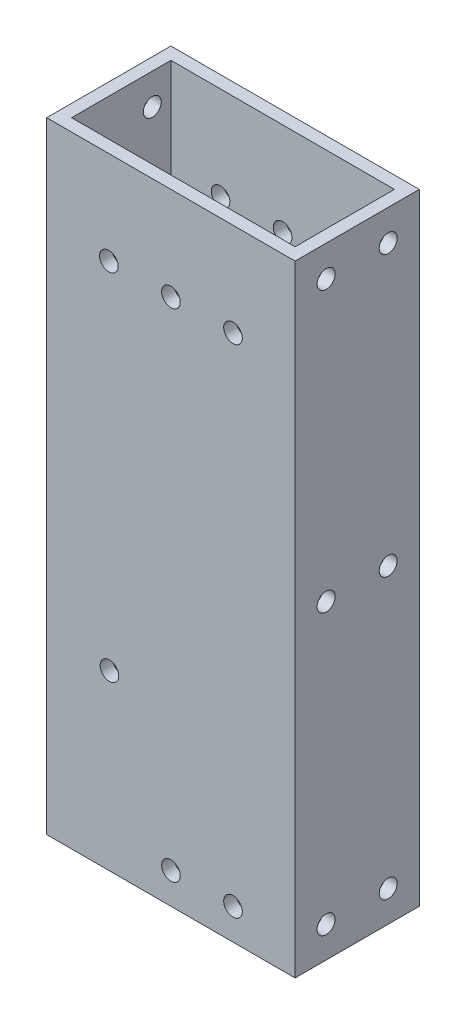
ISO-10303-21;
HEADER;
FILE_DESCRIPTION(('STEP AP214'),'2;1');
FILE_NAME('part.step','',(''),(''),'','','');
FILE_SCHEMA(('AUTOMOTIVE_DESIGN { 1 0 10303 214 1 1 1 1 }'));
ENDSEC;
DATA;
#1=APPLICATION_CONTEXT('core data for automotive mechanical design processes');
#2=APPLICATION_PROTOCOL_DEFINITION('international standard','automotive_design',2000,#1);
#3=PRODUCT_CONTEXT('',#1,'mechanical');
#4=PRODUCT('Part','Part','',(#3));
#5=PRODUCT_RELATED_PRODUCT_CATEGORY('part','',(#4));
#6=PRODUCT_DEFINITION_FORMATION('','',#4);
#7=PRODUCT_DEFINITION_CONTEXT('part definition',#1,'design');
#8=PRODUCT_DEFINITION('design','',#6,#7);
#9=PRODUCT_DEFINITION_SHAPE('','',#8);
#10=(LENGTH_UNIT() NAMED_UNIT(*) SI_UNIT(.MILLI.,.METRE.));
#11=(NAMED_UNIT(*) PLANE_ANGLE_UNIT() SI_UNIT($,.RADIAN.));
#12=(NAMED_UNIT(*) SI_UNIT($,.STERADIAN.) SOLID_ANGLE_UNIT());
#13=UNCERTAINTY_MEASURE_WITH_UNIT(LENGTH_MEASURE(1.E-05),#10,'distance_accuracy_value','');
#14=(GEOMETRIC_REPRESENTATION_CONTEXT(3) GLOBAL_UNCERTAINTY_ASSIGNED_CONTEXT((#13)) GLOBAL_UNIT_ASSIGNED_CONTEXT((#10,
#11,#12)) REPRESENTATION_CONTEXT('',''));
#15=CARTESIAN_POINT('',(0.,0.,0.));
#16=DIRECTION('',(0.,0.,1.));
#17=DIRECTION('',(1.,0.,0.));
#18=AXIS2_PLACEMENT_3D('',#15,#16,#17);
#19=CARTESIAN_POINT('',(0.,50.,0.));
#20=DIRECTION('',(0.,1.,0.));
#21=DIRECTION('',(0.,0.,1.));
#22=AXIS2_PLACEMENT_3D('',#19,#20,#21);
#23=PLANE('',#22);
#24=DIRECTION('',(0.,0.,-1.));
#25=VECTOR('',#24,1.);
#26=CARTESIAN_POINT('',(20.,50.,-10.));
#27=LINE('',#26,#25);
#28=CARTESIAN_POINT('',(20.,50.,10.));
#29=VERTEX_POINT('',#28);
#30=CARTESIAN_POINT('',(20.,50.,-10.));
#31=VERTEX_POINT('',#30);
#32=EDGE_CURVE('E143',#29,#31,#27,.T.);
#33=ORIENTED_EDGE('',*,*,#32,.T.);
#34=DIRECTION('',(-1.,0.,0.));
#35=VECTOR('',#34,1.);
#36=CARTESIAN_POINT('',(-20.,50.,-10.));
#37=LINE('',#36,#35);
#38=CARTESIAN_POINT('',(-20.,50.,-10.));
#39=VERTEX_POINT('',#38);
#40=EDGE_CURVE('E146',#31,#39,#37,.T.);
#41=ORIENTED_EDGE('',*,*,#40,.T.);
#42=DIRECTION('',(0.,0.,1.));
#43=VECTOR('',#42,1.);
#44=CARTESIAN_POINT('',(-20.,50.,-10.));
#45=LINE('',#44,#43);
#46=CARTESIAN_POINT('',(-20.,50.,10.));
#47=VERTEX_POINT('',#46);
#48=EDGE_CURVE('E149',#39,#47,#45,.T.);
#49=ORIENTED_EDGE('',*,*,#48,.T.);
#50=DIRECTION('',(1.,0.,0.));
#51=VECTOR('',#50,1.);
#52=CARTESIAN_POINT('',(-20.,50.,10.));
#53=LINE('',#52,#51);
#54=EDGE_CURVE('E151',#47,#29,#53,.T.);
#55=ORIENTED_EDGE('',*,*,#54,.T.);
#56=EDGE_LOOP('',(#33,#41,#49,#55));
#57=FACE_BOUND('',#56,.T.);
#58=DIRECTION('',(-1.,0.,0.));
#59=VECTOR('',#58,1.);
#60=CARTESIAN_POINT('',(-18.,50.,-8.));
#61=LINE('',#60,#59);
#62=CARTESIAN_POINT('',(18.,50.,-8.));
#63=VERTEX_POINT('',#62);
#64=CARTESIAN_POINT('',(-18.,50.,-8.));
#65=VERTEX_POINT('',#64);
#66=EDGE_CURVE('E113',#63,#65,#61,.T.);
#67=ORIENTED_EDGE('',*,*,#66,.F.);
#68=DIRECTION('',(0.,0.,-1.));
#69=VECTOR('',#68,1.);
#70=CARTESIAN_POINT('',(18.,50.,-8.));
#71=LINE('',#70,#69);
#72=CARTESIAN_POINT('',(18.,50.,8.));
#73=VERTEX_POINT('',#72);
#74=EDGE_CURVE('E105',#73,#63,#71,.T.);
#75=ORIENTED_EDGE('',*,*,#74,.F.);
#76=DIRECTION('',(1.,0.,0.));
#77=VECTOR('',#76,1.);
#78=CARTESIAN_POINT('',(-18.,50.,8.));
#79=LINE('',#78,#77);
#80=CARTESIAN_POINT('',(-18.,50.,8.));
#81=VERTEX_POINT('',#80);
#82=EDGE_CURVE('E127',#81,#73,#79,.T.);
#83=ORIENTED_EDGE('',*,*,#82,.F.);
#84=DIRECTION('',(0.,0.,1.));
#85=VECTOR('',#84,1.);
#86=CARTESIAN_POINT('',(-18.,50.,-8.));
#87=LINE('',#86,#85);
#88=EDGE_CURVE('E125',#65,#81,#87,.T.);
#89=ORIENTED_EDGE('',*,*,#88,.F.);
#90=EDGE_LOOP('',(#67,#75,#83,#89));
#91=FACE_BOUND('',#90,.T.);
#92=ADVANCED_FACE('F38',(#57,#91),#23,.T.);
#93=CARTESIAN_POINT('',(0.,-50.,0.));
#94=DIRECTION('',(0.,1.,0.));
#95=DIRECTION('',(0.,0.,1.));
#96=AXIS2_PLACEMENT_3D('',#93,#94,#95);
#97=PLANE('',#96);
#98=DIRECTION('',(0.,0.,-1.));
#99=VECTOR('',#98,1.);
#100=CARTESIAN_POINT('',(20.,-50.,-10.));
#101=LINE('',#100,#99);
#102=CARTESIAN_POINT('',(20.,-50.,10.));
#103=VERTEX_POINT('',#102);
#104=CARTESIAN_POINT('',(20.,-50.,-10.));
#105=VERTEX_POINT('',#104);
#106=EDGE_CURVE('E121',#103,#105,#101,.T.);
#107=ORIENTED_EDGE('',*,*,#106,.F.);
#108=DIRECTION('',(1.,0.,0.));
#109=VECTOR('',#108,1.);
#110=CARTESIAN_POINT('',(-20.,-50.,10.));
#111=LINE('',#110,#109);
#112=CARTESIAN_POINT('',(-20.,-50.,10.));
#113=VERTEX_POINT('',#112);
#114=EDGE_CURVE('E147',#113,#103,#111,.T.);
#115=ORIENTED_EDGE('',*,*,#114,.F.);
#116=DIRECTION('',(0.,0.,1.));
#117=VECTOR('',#116,1.);
#118=CARTESIAN_POINT('',(-20.,-50.,-10.));
#119=LINE('',#118,#117);
#120=CARTESIAN_POINT('',(-20.,-50.,-10.));
#121=VERTEX_POINT('',#120);
#122=EDGE_CURVE('E158',#121,#113,#119,.T.);
#123=ORIENTED_EDGE('',*,*,#122,.F.);
#124=DIRECTION('',(-1.,0.,0.));
#125=VECTOR('',#124,1.);
#126=CARTESIAN_POINT('',(-20.,-50.,-10.));
#127=LINE('',#126,#125);
#128=EDGE_CURVE('E156',#105,#121,#127,.T.);
#129=ORIENTED_EDGE('',*,*,#128,.F.);
#130=EDGE_LOOP('',(#107,#115,#123,#129));
#131=FACE_BOUND('',#130,.T.);
#132=DIRECTION('',(0.,0.,-1.));
#133=VECTOR('',#132,1.);
#134=CARTESIAN_POINT('',(18.,-50.,-8.));
#135=LINE('',#134,#133);
#136=CARTESIAN_POINT('',(18.,-50.,8.));
#137=VERTEX_POINT('',#136);
#138=CARTESIAN_POINT('',(18.,-50.,-8.));
#139=VERTEX_POINT('',#138);
#140=EDGE_CURVE('E63',#137,#139,#135,.T.);
#141=ORIENTED_EDGE('',*,*,#140,.T.);
#142=DIRECTION('',(-1.,0.,0.));
#143=VECTOR('',#142,1.);
#144=CARTESIAN_POINT('',(-18.,-50.,-8.));
#145=LINE('',#144,#143);
#146=CARTESIAN_POINT('',(-18.,-50.,-8.));
#147=VERTEX_POINT('',#146);
#148=EDGE_CURVE('E120',#139,#147,#145,.T.);
#149=ORIENTED_EDGE('',*,*,#148,.T.);
#150=DIRECTION('',(0.,0.,1.));
#151=VECTOR('',#150,1.);
#152=CARTESIAN_POINT('',(-18.,-50.,-8.));
#153=LINE('',#152,#151);
#154=CARTESIAN_POINT('',(-18.,-50.,8.));
#155=VERTEX_POINT('',#154);
#156=EDGE_CURVE('E135',#147,#155,#153,.T.);
#157=ORIENTED_EDGE('',*,*,#156,.T.);
#158=DIRECTION('',(1.,0.,0.));
#159=VECTOR('',#158,1.);
#160=CARTESIAN_POINT('',(-18.,-50.,8.));
#161=LINE('',#160,#159);
#162=EDGE_CURVE('E114',#155,#137,#161,.T.);
#163=ORIENTED_EDGE('',*,*,#162,.T.);
#164=EDGE_LOOP('',(#141,#149,#157,#163));
#165=FACE_BOUND('',#164,.T.);
#166=ADVANCED_FACE('F326',(#131,#165),#97,.F.);
#167=CARTESIAN_POINT('',(20.,50.,-10.));
#168=DIRECTION('',(-1.,0.,0.));
#169=DIRECTION('',(0.,0.,1.));
#170=AXIS2_PLACEMENT_3D('',#167,#168,#169);
#171=PLANE('',#170);
#172=CARTESIAN_POINT('',(20.,-45.,-5.00000000000001));
#173=DIRECTION('',(1.,0.,0.));
#174=DIRECTION('',(0.,0.,-1.));
#175=AXIS2_PLACEMENT_3D('',#172,#173,#174);
#176=CIRCLE('',#175,1.45);
#177=CARTESIAN_POINT('',(20.,-45.,-6.45000000000001));
#178=VERTEX_POINT('',#177);
#179=EDGE_CURVE('E254',#178,#178,#176,.T.);
#180=ORIENTED_EDGE('',*,*,#179,.F.);
#181=EDGE_LOOP('',(#180));
#182=FACE_BOUND('',#181,.T.);
#183=CARTESIAN_POINT('',(20.,0.,4.99999999999999));
#184=DIRECTION('',(1.,0.,0.));
#185=DIRECTION('',(0.,0.,-1.));
#186=AXIS2_PLACEMENT_3D('',#183,#184,#185);
#187=CIRCLE('',#186,1.45);
#188=CARTESIAN_POINT('',(20.,0.,3.54999999999999));
#189=VERTEX_POINT('',#188);
#190=EDGE_CURVE('E261',#189,#189,#187,.T.);
#191=ORIENTED_EDGE('',*,*,#190,.F.);
#192=EDGE_LOOP('',(#191));
#193=FACE_BOUND('',#192,.T.);
#194=CARTESIAN_POINT('',(20.,0.,-5.00000000000001));
#195=DIRECTION('',(1.,0.,0.));
#196=DIRECTION('',(0.,0.,-1.));
#197=AXIS2_PLACEMENT_3D('',#194,#195,#196);
#198=CIRCLE('',#197,1.45);
#199=CARTESIAN_POINT('',(20.,0.,-6.45000000000001));
#200=VERTEX_POINT('',#199);
#201=EDGE_CURVE('E260',#200,#200,#198,.T.);
#202=ORIENTED_EDGE('',*,*,#201,.F.);
#203=EDGE_LOOP('',(#202));
#204=FACE_BOUND('',#203,.T.);
#205=CARTESIAN_POINT('',(20.,45.,-5.));
#206=DIRECTION('',(1.,0.,0.));
#207=DIRECTION('',(0.,0.,-1.));
#208=AXIS2_PLACEMENT_3D('',#205,#206,#207);
#209=CIRCLE('',#208,1.45);
#210=CARTESIAN_POINT('',(20.,45.,-6.45));
#211=VERTEX_POINT('',#210);
#212=EDGE_CURVE('E273',#211,#211,#209,.T.);
#213=ORIENTED_EDGE('',*,*,#212,.F.);
#214=EDGE_LOOP('',(#213));
#215=FACE_BOUND('',#214,.T.);
#216=CARTESIAN_POINT('',(20.,-45.,4.99999999999999));
#217=DIRECTION('',(1.,0.,0.));
#218=DIRECTION('',(0.,0.,-1.));
#219=AXIS2_PLACEMENT_3D('',#216,#217,#218);
#220=CIRCLE('',#219,1.45);
#221=CARTESIAN_POINT('',(20.,-45.,3.54999999999999));
#222=VERTEX_POINT('',#221);
#223=EDGE_CURVE('E250',#222,#222,#220,.T.);
#224=ORIENTED_EDGE('',*,*,#223,.F.);
#225=EDGE_LOOP('',(#224));
#226=FACE_BOUND('',#225,.T.);
#227=CARTESIAN_POINT('',(20.,45.,5.));
#228=DIRECTION('',(1.,0.,0.));
#229=DIRECTION('',(0.,0.,-1.));
#230=AXIS2_PLACEMENT_3D('',#227,#228,#229);
#231=CIRCLE('',#230,1.45);
#232=CARTESIAN_POINT('',(20.,45.,3.55));
#233=VERTEX_POINT('',#232);
#234=EDGE_CURVE('E272',#233,#233,#231,.T.);
#235=ORIENTED_EDGE('',*,*,#234,.F.);
#236=EDGE_LOOP('',(#235));
#237=FACE_BOUND('',#236,.T.);
#238=ORIENTED_EDGE('',*,*,#106,.T.);
#239=DIRECTION('',(0.,-1.,0.));
#240=VECTOR('',#239,1.);
#241=CARTESIAN_POINT('',(20.,50.,-10.));
#242=LINE('',#241,#240);
#243=EDGE_CURVE('E11',#31,#105,#242,.T.);
#244=ORIENTED_EDGE('',*,*,#243,.F.);
#245=ORIENTED_EDGE('',*,*,#32,.F.);
#246=DIRECTION('',(0.,-1.,0.));
#247=VECTOR('',#246,1.);
#248=CARTESIAN_POINT('',(20.,50.,10.));
#249=LINE('',#248,#247);
#250=EDGE_CURVE('E153',#29,#103,#249,.T.);
#251=ORIENTED_EDGE('',*,*,#250,.T.);
#252=EDGE_LOOP('',(#238,#244,#245,#251));
#253=FACE_BOUND('',#252,.T.);
#254=ADVANCED_FACE('F40',(#182,#193,#204,#215,#226,#237,#253),#171,.F.);
#255=CARTESIAN_POINT('',(-20.,50.,-10.));
#256=DIRECTION('',(0.,0.,1.));
#257=DIRECTION('',(1.,0.,0.));
#258=AXIS2_PLACEMENT_3D('',#255,#256,#257);
#259=PLANE('',#258);
#260=CARTESIAN_POINT('',(-9.89999999999998,-22.087500000001,-10.));
#261=DIRECTION('',(0.,0.,-1.));
#262=DIRECTION('',(-1.,0.,0.));
#263=AXIS2_PLACEMENT_3D('',#260,#261,#262);
#264=CIRCLE('',#263,1.49999999999975);
#265=CARTESIAN_POINT('',(-11.3999999999997,-22.087500000001,-10.));
#266=VERTEX_POINT('',#265);
#267=EDGE_CURVE('E450',#266,#266,#264,.T.);
#268=ORIENTED_EDGE('',*,*,#267,.F.);
#269=EDGE_LOOP('',(#268));
#270=FACE_BOUND('',#269,.T.);
#271=CARTESIAN_POINT('',(10.0000000000001,-44.9999999999994,-10.));
#272=DIRECTION('',(0.,0.,-1.));
#273=DIRECTION('',(-1.,0.,0.));
#274=AXIS2_PLACEMENT_3D('',#271,#272,#273);
#275=CIRCLE('',#274,1.5);
#276=CARTESIAN_POINT('',(8.50000000000012,-44.9999999999994,-10.));
#277=VERTEX_POINT('',#276);
#278=EDGE_CURVE('E442',#277,#277,#275,.T.);
#279=ORIENTED_EDGE('',*,*,#278,.F.);
#280=EDGE_LOOP('',(#279));
#281=FACE_BOUND('',#280,.T.);
#282=CARTESIAN_POINT('',(1.11022302462516E-13,-44.9999999999994,-10.));
#283=DIRECTION('',(0.,0.,-1.));
#284=DIRECTION('',(-1.,0.,0.));
#285=AXIS2_PLACEMENT_3D('',#282,#283,#284);
#286=CIRCLE('',#285,1.5);
#287=CARTESIAN_POINT('',(-1.49999999999989,-44.9999999999994,-10.));
#288=VERTEX_POINT('',#287);
#289=EDGE_CURVE('E221',#288,#288,#286,.T.);
#290=ORIENTED_EDGE('',*,*,#289,.F.);
#291=EDGE_LOOP('',(#290));
#292=FACE_BOUND('',#291,.T.);
#293=CARTESIAN_POINT('',(-10.0000000000004,34.9999999999952,-10.));
#294=DIRECTION('',(0.,0.,-1.));
#295=DIRECTION('',(-1.,0.,0.));
#296=AXIS2_PLACEMENT_3D('',#293,#294,#295);
#297=CIRCLE('',#296,1.5);
#298=CARTESIAN_POINT('',(-11.5000000000004,34.9999999999952,-10.));
#299=VERTEX_POINT('',#298);
#300=EDGE_CURVE('E230',#299,#299,#297,.T.);
#301=ORIENTED_EDGE('',*,*,#300,.F.);
#302=EDGE_LOOP('',(#301));
#303=FACE_BOUND('',#302,.T.);
#304=CARTESIAN_POINT('',(-4.16333634234434E-13,34.9999999999952,-10.));
#305=DIRECTION('',(0.,0.,-1.));
#306=DIRECTION('',(-1.,0.,0.));
#307=AXIS2_PLACEMENT_3D('',#304,#305,#306);
#308=CIRCLE('',#307,1.5);
#309=CARTESIAN_POINT('',(-1.50000000000042,34.9999999999952,-10.));
#310=VERTEX_POINT('',#309);
#311=EDGE_CURVE('E236',#310,#310,#308,.T.);
#312=ORIENTED_EDGE('',*,*,#311,.F.);
#313=EDGE_LOOP('',(#312));
#314=FACE_BOUND('',#313,.T.);
#315=CARTESIAN_POINT('',(9.99999999999372,34.9999999999981,-10.));
#316=DIRECTION('',(0.,0.,-1.));
#317=DIRECTION('',(-1.,0.,0.));
#318=AXIS2_PLACEMENT_3D('',#315,#316,#317);
#319=CIRCLE('',#318,1.5);
#320=CARTESIAN_POINT('',(8.49999999999372,34.9999999999981,-10.));
#321=VERTEX_POINT('',#320);
#322=EDGE_CURVE('E227',#321,#321,#319,.T.);
#323=ORIENTED_EDGE('',*,*,#322,.F.);
#324=EDGE_LOOP('',(#323));
#325=FACE_BOUND('',#324,.T.);
#326=ORIENTED_EDGE('',*,*,#128,.T.);
#327=DIRECTION('',(0.,-1.,0.));
#328=VECTOR('',#327,1.);
#329=CARTESIAN_POINT('',(-20.,50.,-10.));
#330=LINE('',#329,#328);
#331=EDGE_CURVE('E47',#39,#121,#330,.T.);
#332=ORIENTED_EDGE('',*,*,#331,.F.);
#333=ORIENTED_EDGE('',*,*,#40,.F.);
#334=ORIENTED_EDGE('',*,*,#243,.T.);
#335=EDGE_LOOP('',(#326,#332,#333,#334));
#336=FACE_BOUND('',#335,.T.);
#337=ADVANCED_FACE('F325',(#270,#281,#292,#303,#314,#325,#336),#259,.F.);
#338=CARTESIAN_POINT('',(-20.,50.,-10.));
#339=DIRECTION('',(1.,0.,0.));
#340=DIRECTION('',(0.,0.,-1.));
#341=AXIS2_PLACEMENT_3D('',#338,#339,#340);
#342=PLANE('',#341);
#343=CARTESIAN_POINT('',(-20.,-45.,-5.));
#344=DIRECTION('',(1.,0.,0.));
#345=DIRECTION('',(0.,0.,-1.));
#346=AXIS2_PLACEMENT_3D('',#343,#344,#345);
#347=CIRCLE('',#346,1.45);
#348=CARTESIAN_POINT('',(-20.,-45.,-6.45));
#349=VERTEX_POINT('',#348);
#350=EDGE_CURVE('E264',#349,#349,#347,.T.);
#351=ORIENTED_EDGE('',*,*,#350,.T.);
#352=EDGE_LOOP('',(#351));
#353=FACE_BOUND('',#352,.T.);
#354=CARTESIAN_POINT('',(-20.,0.,5.00000000000001));
#355=DIRECTION('',(1.,0.,0.));
#356=DIRECTION('',(0.,0.,-1.));
#357=AXIS2_PLACEMENT_3D('',#354,#355,#356);
#358=CIRCLE('',#357,1.45);
#359=CARTESIAN_POINT('',(-20.,0.,3.55000000000001));
#360=VERTEX_POINT('',#359);
#361=EDGE_CURVE('E257',#360,#360,#358,.T.);
#362=ORIENTED_EDGE('',*,*,#361,.T.);
#363=EDGE_LOOP('',(#362));
#364=FACE_BOUND('',#363,.T.);
#365=CARTESIAN_POINT('',(-20.,0.,-4.99999999999999));
#366=DIRECTION('',(1.,0.,0.));
#367=DIRECTION('',(0.,0.,-1.));
#368=AXIS2_PLACEMENT_3D('',#365,#366,#367);
#369=CIRCLE('',#368,1.45);
#370=CARTESIAN_POINT('',(-20.,0.,-6.44999999999999));
#371=VERTEX_POINT('',#370);
#372=EDGE_CURVE('E276',#371,#371,#369,.T.);
#373=ORIENTED_EDGE('',*,*,#372,.T.);
#374=EDGE_LOOP('',(#373));
#375=FACE_BOUND('',#374,.T.);
#376=CARTESIAN_POINT('',(-20.,45.,-4.99999999999999));
#377=DIRECTION('',(1.,0.,0.));
#378=DIRECTION('',(0.,0.,-1.));
#379=AXIS2_PLACEMENT_3D('',#376,#377,#378);
#380=CIRCLE('',#379,1.45);
#381=CARTESIAN_POINT('',(-20.,45.,-6.44999999999999));
#382=VERTEX_POINT('',#381);
#383=EDGE_CURVE('E269',#382,#382,#380,.T.);
#384=ORIENTED_EDGE('',*,*,#383,.T.);
#385=EDGE_LOOP('',(#384));
#386=FACE_BOUND('',#385,.T.);
#387=CARTESIAN_POINT('',(-20.,-45.,5.));
#388=DIRECTION('',(1.,0.,0.));
#389=DIRECTION('',(0.,0.,-1.));
#390=AXIS2_PLACEMENT_3D('',#387,#388,#389);
#391=CIRCLE('',#390,1.45);
#392=CARTESIAN_POINT('',(-20.,-45.,3.55));
#393=VERTEX_POINT('',#392);
#394=EDGE_CURVE('E251',#393,#393,#391,.T.);
#395=ORIENTED_EDGE('',*,*,#394,.T.);
#396=EDGE_LOOP('',(#395));
#397=FACE_BOUND('',#396,.T.);
#398=CARTESIAN_POINT('',(-20.,45.,5.00000000000001));
#399=DIRECTION('',(1.,0.,0.));
#400=DIRECTION('',(0.,0.,-1.));
#401=AXIS2_PLACEMENT_3D('',#398,#399,#400);
#402=CIRCLE('',#401,1.45);
#403=CARTESIAN_POINT('',(-20.,45.,3.55000000000001));
#404=VERTEX_POINT('',#403);
#405=EDGE_CURVE('E172',#404,#404,#402,.T.);
#406=ORIENTED_EDGE('',*,*,#405,.T.);
#407=EDGE_LOOP('',(#406));
#408=FACE_BOUND('',#407,.T.);
#409=ORIENTED_EDGE('',*,*,#122,.T.);
#410=DIRECTION('',(0.,-1.,0.));
#411=VECTOR('',#410,1.);
#412=CARTESIAN_POINT('',(-20.,50.,10.));
#413=LINE('',#412,#411);
#414=EDGE_CURVE('E163',#47,#113,#413,.T.);
#415=ORIENTED_EDGE('',*,*,#414,.F.);
#416=ORIENTED_EDGE('',*,*,#48,.F.);
#417=ORIENTED_EDGE('',*,*,#331,.T.);
#418=EDGE_LOOP('',(#409,#415,#416,#417));
#419=FACE_BOUND('',#418,.T.);
#420=ADVANCED_FACE('F344',(#353,#364,#375,#386,#397,#408,#419),#342,.F.);
#421=CARTESIAN_POINT('',(-20.,50.,10.));
#422=DIRECTION('',(0.,0.,-1.));
#423=DIRECTION('',(-1.,0.,0.));
#424=AXIS2_PLACEMENT_3D('',#421,#422,#423);
#425=PLANE('',#424);
#426=CARTESIAN_POINT('',(-9.89999999999998,-22.087500000001,10.));
#427=DIRECTION('',(0.,0.,-1.));
#428=DIRECTION('',(-1.,0.,0.));
#429=AXIS2_PLACEMENT_3D('',#426,#427,#428);
#430=CIRCLE('',#429,1.49999999999975);
#431=CARTESIAN_POINT('',(-11.3999999999997,-22.087500000001,10.));
#432=VERTEX_POINT('',#431);
#433=EDGE_CURVE('E445',#432,#432,#430,.T.);
#434=ORIENTED_EDGE('',*,*,#433,.T.);
#435=EDGE_LOOP('',(#434));
#436=FACE_BOUND('',#435,.T.);
#437=CARTESIAN_POINT('',(10.0000000000001,-44.9999999999994,10.));
#438=DIRECTION('',(0.,0.,-1.));
#439=DIRECTION('',(-1.,0.,0.));
#440=AXIS2_PLACEMENT_3D('',#437,#438,#439);
#441=CIRCLE('',#440,1.5);
#442=CARTESIAN_POINT('',(8.50000000000012,-44.9999999999994,10.));
#443=VERTEX_POINT('',#442);
#444=EDGE_CURVE('E444',#443,#443,#441,.T.);
#445=ORIENTED_EDGE('',*,*,#444,.T.);
#446=EDGE_LOOP('',(#445));
#447=FACE_BOUND('',#446,.T.);
#448=CARTESIAN_POINT('',(1.11022302462516E-13,-44.9999999999994,10.));
#449=DIRECTION('',(0.,0.,-1.));
#450=DIRECTION('',(-1.,0.,0.));
#451=AXIS2_PLACEMENT_3D('',#448,#449,#450);
#452=CIRCLE('',#451,1.5);
#453=CARTESIAN_POINT('',(-1.49999999999989,-44.9999999999994,10.));
#454=VERTEX_POINT('',#453);
#455=EDGE_CURVE('E208',#454,#454,#452,.T.);
#456=ORIENTED_EDGE('',*,*,#455,.T.);
#457=EDGE_LOOP('',(#456));
#458=FACE_BOUND('',#457,.T.);
#459=CARTESIAN_POINT('',(-10.0000000000004,34.9999999999952,10.));
#460=DIRECTION('',(0.,0.,-1.));
#461=DIRECTION('',(-1.,0.,0.));
#462=AXIS2_PLACEMENT_3D('',#459,#460,#461);
#463=CIRCLE('',#462,1.5);
#464=CARTESIAN_POINT('',(-11.5000000000004,34.9999999999952,10.));
#465=VERTEX_POINT('',#464);
#466=EDGE_CURVE('E196',#465,#465,#463,.T.);
#467=ORIENTED_EDGE('',*,*,#466,.T.);
#468=EDGE_LOOP('',(#467));
#469=FACE_BOUND('',#468,.T.);
#470=CARTESIAN_POINT('',(-4.16333634234434E-13,34.9999999999952,10.));
#471=DIRECTION('',(0.,0.,-1.));
#472=DIRECTION('',(-1.,0.,0.));
#473=AXIS2_PLACEMENT_3D('',#470,#471,#472);
#474=CIRCLE('',#473,1.5);
#475=CARTESIAN_POINT('',(-1.50000000000042,34.9999999999952,10.));
#476=VERTEX_POINT('',#475);
#477=EDGE_CURVE('E233',#476,#476,#474,.T.);
#478=ORIENTED_EDGE('',*,*,#477,.T.);
#479=EDGE_LOOP('',(#478));
#480=FACE_BOUND('',#479,.T.);
#481=CARTESIAN_POINT('',(9.99999999999372,34.9999999999981,10.));
#482=DIRECTION('',(0.,0.,-1.));
#483=DIRECTION('',(-1.,0.,0.));
#484=AXIS2_PLACEMENT_3D('',#481,#482,#483);
#485=CIRCLE('',#484,1.5);
#486=CARTESIAN_POINT('',(8.49999999999372,34.9999999999981,10.));
#487=VERTEX_POINT('',#486);
#488=EDGE_CURVE('E239',#487,#487,#485,.T.);
#489=ORIENTED_EDGE('',*,*,#488,.T.);
#490=EDGE_LOOP('',(#489));
#491=FACE_BOUND('',#490,.T.);
#492=ORIENTED_EDGE('',*,*,#114,.T.);
#493=ORIENTED_EDGE('',*,*,#250,.F.);
#494=ORIENTED_EDGE('',*,*,#54,.F.);
#495=ORIENTED_EDGE('',*,*,#414,.T.);
#496=EDGE_LOOP('',(#492,#493,#494,#495));
#497=FACE_BOUND('',#496,.T.);
#498=ADVANCED_FACE('F302',(#436,#447,#458,#469,#480,#491,#497),#425,.F.);
#499=CARTESIAN_POINT('',(18.,50.,-8.));
#500=DIRECTION('',(-1.,0.,0.));
#501=DIRECTION('',(0.,0.,1.));
#502=AXIS2_PLACEMENT_3D('',#499,#500,#501);
#503=PLANE('',#502);
#504=CARTESIAN_POINT('',(18.,-45.,-5.00000000000001));
#505=DIRECTION('',(-1.,0.,0.));
#506=DIRECTION('',(0.,0.,1.));
#507=AXIS2_PLACEMENT_3D('',#504,#505,#506);
#508=CIRCLE('',#507,1.45);
#509=CARTESIAN_POINT('',(18.,-45.,-3.55000000000001));
#510=VERTEX_POINT('',#509);
#511=EDGE_CURVE('E133',#510,#510,#508,.T.);
#512=ORIENTED_EDGE('',*,*,#511,.F.);
#513=EDGE_LOOP('',(#512));
#514=FACE_BOUND('',#513,.T.);
#515=CARTESIAN_POINT('',(18.,0.,4.99999999999999));
#516=DIRECTION('',(-1.,0.,0.));
#517=DIRECTION('',(0.,0.,1.));
#518=AXIS2_PLACEMENT_3D('',#515,#516,#517);
#519=CIRCLE('',#518,1.45);
#520=CARTESIAN_POINT('',(18.,0.,6.44999999999999));
#521=VERTEX_POINT('',#520);
#522=EDGE_CURVE('E188',#521,#521,#519,.T.);
#523=ORIENTED_EDGE('',*,*,#522,.F.);
#524=EDGE_LOOP('',(#523));
#525=FACE_BOUND('',#524,.T.);
#526=CARTESIAN_POINT('',(18.,0.,-5.00000000000001));
#527=DIRECTION('',(-1.,0.,0.));
#528=DIRECTION('',(0.,0.,1.));
#529=AXIS2_PLACEMENT_3D('',#526,#527,#528);
#530=CIRCLE('',#529,1.45);
#531=CARTESIAN_POINT('',(18.,0.,-3.55000000000001));
#532=VERTEX_POINT('',#531);
#533=EDGE_CURVE('E184',#532,#532,#530,.T.);
#534=ORIENTED_EDGE('',*,*,#533,.F.);
#535=EDGE_LOOP('',(#534));
#536=FACE_BOUND('',#535,.T.);
#537=CARTESIAN_POINT('',(18.,45.,-5.));
#538=DIRECTION('',(-1.,0.,0.));
#539=DIRECTION('',(0.,0.,1.));
#540=AXIS2_PLACEMENT_3D('',#537,#538,#539);
#541=CIRCLE('',#540,1.45);
#542=CARTESIAN_POINT('',(18.,45.,-3.55));
#543=VERTEX_POINT('',#542);
#544=EDGE_CURVE('E180',#543,#543,#541,.T.);
#545=ORIENTED_EDGE('',*,*,#544,.F.);
#546=EDGE_LOOP('',(#545));
#547=FACE_BOUND('',#546,.T.);
#548=CARTESIAN_POINT('',(18.,-45.,4.99999999999999));
#549=DIRECTION('',(-1.,0.,0.));
#550=DIRECTION('',(0.,0.,1.));
#551=AXIS2_PLACEMENT_3D('',#548,#549,#550);
#552=CIRCLE('',#551,1.45);
#553=CARTESIAN_POINT('',(18.,-45.,6.44999999999999));
#554=VERTEX_POINT('',#553);
#555=EDGE_CURVE('E176',#554,#554,#552,.T.);
#556=ORIENTED_EDGE('',*,*,#555,.F.);
#557=EDGE_LOOP('',(#556));
#558=FACE_BOUND('',#557,.T.);
#559=CARTESIAN_POINT('',(18.,45.,5.));
#560=DIRECTION('',(-1.,0.,0.));
#561=DIRECTION('',(0.,0.,1.));
#562=AXIS2_PLACEMENT_3D('',#559,#560,#561);
#563=CIRCLE('',#562,1.45);
#564=CARTESIAN_POINT('',(18.,45.,6.45));
#565=VERTEX_POINT('',#564);
#566=EDGE_CURVE('E171',#565,#565,#563,.T.);
#567=ORIENTED_EDGE('',*,*,#566,.F.);
#568=EDGE_LOOP('',(#567));
#569=FACE_BOUND('',#568,.T.);
#570=ORIENTED_EDGE('',*,*,#140,.F.);
#571=DIRECTION('',(0.,-1.,0.));
#572=VECTOR('',#571,1.);
#573=CARTESIAN_POINT('',(18.,50.,8.));
#574=LINE('',#573,#572);
#575=EDGE_CURVE('E109',#73,#137,#574,.T.);
#576=ORIENTED_EDGE('',*,*,#575,.F.);
#577=ORIENTED_EDGE('',*,*,#74,.T.);
#578=DIRECTION('',(0.,-1.,0.));
#579=VECTOR('',#578,1.);
#580=CARTESIAN_POINT('',(18.,50.,-8.));
#581=LINE('',#580,#579);
#582=EDGE_CURVE('E108',#63,#139,#581,.T.);
#583=ORIENTED_EDGE('',*,*,#582,.T.);
#584=EDGE_LOOP('',(#570,#576,#577,#583));
#585=FACE_BOUND('',#584,.T.);
#586=ADVANCED_FACE('F107',(#514,#525,#536,#547,#558,#569,#585),#503,.T.);
#587=CARTESIAN_POINT('',(-18.,50.,-8.));
#588=DIRECTION('',(0.,0.,1.));
#589=DIRECTION('',(1.,0.,0.));
#590=AXIS2_PLACEMENT_3D('',#587,#588,#589);
#591=PLANE('',#590);
#592=CARTESIAN_POINT('',(-9.89999999999998,-22.087500000001,-8.));
#593=DIRECTION('',(0.,0.,1.));
#594=DIRECTION('',(1.,0.,0.));
#595=AXIS2_PLACEMENT_3D('',#592,#593,#594);
#596=CIRCLE('',#595,1.49999999999975);
#597=CARTESIAN_POINT('',(-8.40000000000023,-22.087500000001,-8.));
#598=VERTEX_POINT('',#597);
#599=EDGE_CURVE('E224',#598,#598,#596,.T.);
#600=ORIENTED_EDGE('',*,*,#599,.F.);
#601=EDGE_LOOP('',(#600));
#602=FACE_BOUND('',#601,.T.);
#603=CARTESIAN_POINT('',(10.0000000000001,-44.9999999999994,-8.));
#604=DIRECTION('',(0.,0.,1.));
#605=DIRECTION('',(1.,0.,0.));
#606=AXIS2_PLACEMENT_3D('',#603,#604,#605);
#607=CIRCLE('',#606,1.5);
#608=CARTESIAN_POINT('',(11.5000000000001,-44.9999999999994,-8.));
#609=VERTEX_POINT('',#608);
#610=EDGE_CURVE('E211',#609,#609,#607,.T.);
#611=ORIENTED_EDGE('',*,*,#610,.F.);
#612=EDGE_LOOP('',(#611));
#613=FACE_BOUND('',#612,.T.);
#614=CARTESIAN_POINT('',(1.11022302462516E-13,-44.9999999999994,-8.));
#615=DIRECTION('',(0.,0.,1.));
#616=DIRECTION('',(1.,0.,0.));
#617=AXIS2_PLACEMENT_3D('',#614,#615,#616);
#618=CIRCLE('',#617,1.5);
#619=CARTESIAN_POINT('',(1.50000000000011,-44.9999999999994,-8.));
#620=VERTEX_POINT('',#619);
#621=EDGE_CURVE('E207',#620,#620,#618,.T.);
#622=ORIENTED_EDGE('',*,*,#621,.F.);
#623=EDGE_LOOP('',(#622));
#624=FACE_BOUND('',#623,.T.);
#625=CARTESIAN_POINT('',(-10.0000000000004,34.9999999999952,-8.));
#626=DIRECTION('',(0.,0.,1.));
#627=DIRECTION('',(1.,0.,0.));
#628=AXIS2_PLACEMENT_3D('',#625,#626,#627);
#629=CIRCLE('',#628,1.5);
#630=CARTESIAN_POINT('',(-8.50000000000042,34.9999999999952,-8.));
#631=VERTEX_POINT('',#630);
#632=EDGE_CURVE('E204',#631,#631,#629,.T.);
#633=ORIENTED_EDGE('',*,*,#632,.F.);
#634=EDGE_LOOP('',(#633));
#635=FACE_BOUND('',#634,.T.);
#636=CARTESIAN_POINT('',(-4.16333634234434E-13,34.9999999999952,-8.));
#637=DIRECTION('',(0.,0.,1.));
#638=DIRECTION('',(1.,0.,0.));
#639=AXIS2_PLACEMENT_3D('',#636,#637,#638);
#640=CIRCLE('',#639,1.5);
#641=CARTESIAN_POINT('',(1.49999999999959,34.9999999999952,-8.));
#642=VERTEX_POINT('',#641);
#643=EDGE_CURVE('E200',#642,#642,#640,.T.);
#644=ORIENTED_EDGE('',*,*,#643,.F.);
#645=EDGE_LOOP('',(#644));
#646=FACE_BOUND('',#645,.T.);
#647=CARTESIAN_POINT('',(9.99999999999372,34.9999999999981,-8.));
#648=DIRECTION('',(0.,0.,1.));
#649=DIRECTION('',(1.,0.,0.));
#650=AXIS2_PLACEMENT_3D('',#647,#648,#649);
#651=CIRCLE('',#650,1.5);
#652=CARTESIAN_POINT('',(11.4999999999937,34.9999999999981,-8.));
#653=VERTEX_POINT('',#652);
#654=EDGE_CURVE('E195',#653,#653,#651,.T.);
#655=ORIENTED_EDGE('',*,*,#654,.F.);
#656=EDGE_LOOP('',(#655));
#657=FACE_BOUND('',#656,.T.);
#658=ORIENTED_EDGE('',*,*,#148,.F.);
#659=ORIENTED_EDGE('',*,*,#582,.F.);
#660=ORIENTED_EDGE('',*,*,#66,.T.);
#661=DIRECTION('',(0.,-1.,0.));
#662=VECTOR('',#661,1.);
#663=CARTESIAN_POINT('',(-18.,50.,-8.));
#664=LINE('',#663,#662);
#665=EDGE_CURVE('E122',#65,#147,#664,.T.);
#666=ORIENTED_EDGE('',*,*,#665,.T.);
#667=EDGE_LOOP('',(#658,#659,#660,#666));
#668=FACE_BOUND('',#667,.T.);
#669=ADVANCED_FACE('F117',(#602,#613,#624,#635,#646,#657,#668),#591,.T.);
#670=CARTESIAN_POINT('',(-18.,50.,-8.));
#671=DIRECTION('',(1.,0.,0.));
#672=DIRECTION('',(0.,0.,-1.));
#673=AXIS2_PLACEMENT_3D('',#670,#671,#672);
#674=PLANE('',#673);
#675=CARTESIAN_POINT('',(-18.,-45.,-5.));
#676=DIRECTION('',(1.,0.,0.));
#677=DIRECTION('',(0.,0.,-1.));
#678=AXIS2_PLACEMENT_3D('',#675,#676,#677);
#679=CIRCLE('',#678,1.45);
#680=CARTESIAN_POINT('',(-18.,-45.,-6.45));
#681=VERTEX_POINT('',#680);
#682=EDGE_CURVE('E189',#681,#681,#679,.T.);
#683=ORIENTED_EDGE('',*,*,#682,.F.);
#684=EDGE_LOOP('',(#683));
#685=FACE_BOUND('',#684,.T.);
#686=CARTESIAN_POINT('',(-18.,0.,5.00000000000001));
#687=DIRECTION('',(1.,0.,0.));
#688=DIRECTION('',(0.,0.,-1.));
#689=AXIS2_PLACEMENT_3D('',#686,#687,#688);
#690=CIRCLE('',#689,1.45);
#691=CARTESIAN_POINT('',(-18.,0.,3.55000000000001));
#692=VERTEX_POINT('',#691);
#693=EDGE_CURVE('E185',#692,#692,#690,.T.);
#694=ORIENTED_EDGE('',*,*,#693,.F.);
#695=EDGE_LOOP('',(#694));
#696=FACE_BOUND('',#695,.T.);
#697=CARTESIAN_POINT('',(-18.,0.,-4.99999999999999));
#698=DIRECTION('',(1.,0.,0.));
#699=DIRECTION('',(0.,0.,-1.));
#700=AXIS2_PLACEMENT_3D('',#697,#698,#699);
#701=CIRCLE('',#700,1.45);
#702=CARTESIAN_POINT('',(-18.,0.,-6.44999999999999));
#703=VERTEX_POINT('',#702);
#704=EDGE_CURVE('E181',#703,#703,#701,.T.);
#705=ORIENTED_EDGE('',*,*,#704,.F.);
#706=EDGE_LOOP('',(#705));
#707=FACE_BOUND('',#706,.T.);
#708=CARTESIAN_POINT('',(-18.,45.,-4.99999999999999));
#709=DIRECTION('',(1.,0.,0.));
#710=DIRECTION('',(0.,0.,-1.));
#711=AXIS2_PLACEMENT_3D('',#708,#709,#710);
#712=CIRCLE('',#711,1.45);
#713=CARTESIAN_POINT('',(-18.,45.,-6.44999999999999));
#714=VERTEX_POINT('',#713);
#715=EDGE_CURVE('E177',#714,#714,#712,.T.);
#716=ORIENTED_EDGE('',*,*,#715,.F.);
#717=EDGE_LOOP('',(#716));
#718=FACE_BOUND('',#717,.T.);
#719=CARTESIAN_POINT('',(-18.,-45.,5.));
#720=DIRECTION('',(1.,0.,0.));
#721=DIRECTION('',(0.,0.,-1.));
#722=AXIS2_PLACEMENT_3D('',#719,#720,#721);
#723=CIRCLE('',#722,1.45);
#724=CARTESIAN_POINT('',(-18.,-45.,3.55));
#725=VERTEX_POINT('',#724);
#726=EDGE_CURVE('E173',#725,#725,#723,.T.);
#727=ORIENTED_EDGE('',*,*,#726,.F.);
#728=EDGE_LOOP('',(#727));
#729=FACE_BOUND('',#728,.T.);
#730=CARTESIAN_POINT('',(-18.,45.,5.00000000000001));
#731=DIRECTION('',(1.,0.,0.));
#732=DIRECTION('',(0.,0.,-1.));
#733=AXIS2_PLACEMENT_3D('',#730,#731,#732);
#734=CIRCLE('',#733,1.45);
#735=CARTESIAN_POINT('',(-18.,45.,3.55000000000001));
#736=VERTEX_POINT('',#735);
#737=EDGE_CURVE('E168',#736,#736,#734,.T.);
#738=ORIENTED_EDGE('',*,*,#737,.F.);
#739=EDGE_LOOP('',(#738));
#740=FACE_BOUND('',#739,.T.);
#741=ORIENTED_EDGE('',*,*,#156,.F.);
#742=ORIENTED_EDGE('',*,*,#665,.F.);
#743=ORIENTED_EDGE('',*,*,#88,.T.);
#744=DIRECTION('',(0.,-1.,0.));
#745=VECTOR('',#744,1.);
#746=CARTESIAN_POINT('',(-18.,50.,8.));
#747=LINE('',#746,#745);
#748=EDGE_CURVE('E55',#81,#155,#747,.T.);
#749=ORIENTED_EDGE('',*,*,#748,.T.);
#750=EDGE_LOOP('',(#741,#742,#743,#749));
#751=FACE_BOUND('',#750,.T.);
#752=ADVANCED_FACE('F367',(#685,#696,#707,#718,#729,#740,#751),#674,.T.);
#753=CARTESIAN_POINT('',(-18.,50.,8.));
#754=DIRECTION('',(0.,0.,-1.));
#755=DIRECTION('',(-1.,0.,0.));
#756=AXIS2_PLACEMENT_3D('',#753,#754,#755);
#757=PLANE('',#756);
#758=CARTESIAN_POINT('',(-9.89999999999998,-22.087500000001,8.));
#759=DIRECTION('',(0.,0.,-1.));
#760=DIRECTION('',(-1.,0.,0.));
#761=AXIS2_PLACEMENT_3D('',#758,#759,#760);
#762=CIRCLE('',#761,1.49999999999975);
#763=CARTESIAN_POINT('',(-11.3999999999997,-22.087500000001,8.));
#764=VERTEX_POINT('',#763);
#765=EDGE_CURVE('E42',#764,#764,#762,.T.);
#766=ORIENTED_EDGE('',*,*,#765,.F.);
#767=EDGE_LOOP('',(#766));
#768=FACE_BOUND('',#767,.T.);
#769=CARTESIAN_POINT('',(10.0000000000001,-44.9999999999994,8.));
#770=DIRECTION('',(0.,0.,-1.));
#771=DIRECTION('',(-1.,0.,0.));
#772=AXIS2_PLACEMENT_3D('',#769,#770,#771);
#773=CIRCLE('',#772,1.5);
#774=CARTESIAN_POINT('',(8.50000000000012,-44.9999999999994,8.));
#775=VERTEX_POINT('',#774);
#776=EDGE_CURVE('E209',#775,#775,#773,.T.);
#777=ORIENTED_EDGE('',*,*,#776,.F.);
#778=EDGE_LOOP('',(#777));
#779=FACE_BOUND('',#778,.T.);
#780=CARTESIAN_POINT('',(1.11022302462516E-13,-44.9999999999994,8.));
#781=DIRECTION('',(0.,0.,-1.));
#782=DIRECTION('',(-1.,0.,0.));
#783=AXIS2_PLACEMENT_3D('',#780,#781,#782);
#784=CIRCLE('',#783,1.5);
#785=CARTESIAN_POINT('',(-1.49999999999989,-44.9999999999994,8.));
#786=VERTEX_POINT('',#785);
#787=EDGE_CURVE('E205',#786,#786,#784,.T.);
#788=ORIENTED_EDGE('',*,*,#787,.F.);
#789=EDGE_LOOP('',(#788));
#790=FACE_BOUND('',#789,.T.);
#791=CARTESIAN_POINT('',(-10.0000000000004,34.9999999999952,8.));
#792=DIRECTION('',(0.,0.,-1.));
#793=DIRECTION('',(-1.,0.,0.));
#794=AXIS2_PLACEMENT_3D('',#791,#792,#793);
#795=CIRCLE('',#794,1.5);
#796=CARTESIAN_POINT('',(-11.5000000000004,34.9999999999952,8.));
#797=VERTEX_POINT('',#796);
#798=EDGE_CURVE('E201',#797,#797,#795,.T.);
#799=ORIENTED_EDGE('',*,*,#798,.F.);
#800=EDGE_LOOP('',(#799));
#801=FACE_BOUND('',#800,.T.);
#802=CARTESIAN_POINT('',(-4.16333634234434E-13,34.9999999999952,8.));
#803=DIRECTION('',(0.,0.,-1.));
#804=DIRECTION('',(-1.,0.,0.));
#805=AXIS2_PLACEMENT_3D('',#802,#803,#804);
#806=CIRCLE('',#805,1.5);
#807=CARTESIAN_POINT('',(-1.50000000000042,34.9999999999952,8.));
#808=VERTEX_POINT('',#807);
#809=EDGE_CURVE('E197',#808,#808,#806,.T.);
#810=ORIENTED_EDGE('',*,*,#809,.F.);
#811=EDGE_LOOP('',(#810));
#812=FACE_BOUND('',#811,.T.);
#813=CARTESIAN_POINT('',(9.99999999999372,34.9999999999981,8.));
#814=DIRECTION('',(0.,0.,-1.));
#815=DIRECTION('',(-1.,0.,0.));
#816=AXIS2_PLACEMENT_3D('',#813,#814,#815);
#817=CIRCLE('',#816,1.5);
#818=CARTESIAN_POINT('',(8.49999999999372,34.9999999999981,8.));
#819=VERTEX_POINT('',#818);
#820=EDGE_CURVE('E192',#819,#819,#817,.T.);
#821=ORIENTED_EDGE('',*,*,#820,.F.);
#822=EDGE_LOOP('',(#821));
#823=FACE_BOUND('',#822,.T.);
#824=ORIENTED_EDGE('',*,*,#162,.F.);
#825=ORIENTED_EDGE('',*,*,#748,.F.);
#826=ORIENTED_EDGE('',*,*,#82,.T.);
#827=ORIENTED_EDGE('',*,*,#575,.T.);
#828=EDGE_LOOP('',(#824,#825,#826,#827));
#829=FACE_BOUND('',#828,.T.);
#830=ADVANCED_FACE('F371',(#768,#779,#790,#801,#812,#823,#829),#757,.T.);
#831=CARTESIAN_POINT('',(-20.,45.,5.00000000000001));
#832=DIRECTION('',(1.,0.,0.));
#833=DIRECTION('',(0.,0.,-1.));
#834=AXIS2_PLACEMENT_3D('',#831,#832,#833);
#835=CYLINDRICAL_SURFACE('',#834,1.45);
#836=ORIENTED_EDGE('',*,*,#737,.T.);
#837=EDGE_LOOP('',(#836));
#838=FACE_BOUND('',#837,.T.);
#839=ORIENTED_EDGE('',*,*,#405,.F.);
#840=EDGE_LOOP('',(#839));
#841=FACE_BOUND('',#840,.T.);
#842=ADVANCED_FACE('F320',(#838,#841),#835,.F.);
#843=CARTESIAN_POINT('',(-20.,-45.,5.));
#844=DIRECTION('',(1.,0.,0.));
#845=DIRECTION('',(0.,0.,-1.));
#846=AXIS2_PLACEMENT_3D('',#843,#844,#845);
#847=CYLINDRICAL_SURFACE('',#846,1.45);
#848=ORIENTED_EDGE('',*,*,#726,.T.);
#849=EDGE_LOOP('',(#848));
#850=FACE_BOUND('',#849,.T.);
#851=ORIENTED_EDGE('',*,*,#394,.F.);
#852=EDGE_LOOP('',(#851));
#853=FACE_BOUND('',#852,.T.);
#854=ADVANCED_FACE('F377',(#850,#853),#847,.F.);
#855=CARTESIAN_POINT('',(-20.,45.,-4.99999999999999));
#856=DIRECTION('',(1.,0.,0.));
#857=DIRECTION('',(0.,0.,-1.));
#858=AXIS2_PLACEMENT_3D('',#855,#856,#857);
#859=CYLINDRICAL_SURFACE('',#858,1.45);
#860=ORIENTED_EDGE('',*,*,#715,.T.);
#861=EDGE_LOOP('',(#860));
#862=FACE_BOUND('',#861,.T.);
#863=ORIENTED_EDGE('',*,*,#383,.F.);
#864=EDGE_LOOP('',(#863));
#865=FACE_BOUND('',#864,.T.);
#866=ADVANCED_FACE('F383',(#862,#865),#859,.F.);
#867=CARTESIAN_POINT('',(-20.,0.,-4.99999999999999));
#868=DIRECTION('',(1.,0.,0.));
#869=DIRECTION('',(0.,0.,-1.));
#870=AXIS2_PLACEMENT_3D('',#867,#868,#869);
#871=CYLINDRICAL_SURFACE('',#870,1.45);
#872=ORIENTED_EDGE('',*,*,#704,.T.);
#873=EDGE_LOOP('',(#872));
#874=FACE_BOUND('',#873,.T.);
#875=ORIENTED_EDGE('',*,*,#372,.F.);
#876=EDGE_LOOP('',(#875));
#877=FACE_BOUND('',#876,.T.);
#878=ADVANCED_FACE('F379',(#874,#877),#871,.F.);
#879=CARTESIAN_POINT('',(-20.,0.,5.00000000000001));
#880=DIRECTION('',(1.,0.,0.));
#881=DIRECTION('',(0.,0.,-1.));
#882=AXIS2_PLACEMENT_3D('',#879,#880,#881);
#883=CYLINDRICAL_SURFACE('',#882,1.45);
#884=ORIENTED_EDGE('',*,*,#693,.T.);
#885=EDGE_LOOP('',(#884));
#886=FACE_BOUND('',#885,.T.);
#887=ORIENTED_EDGE('',*,*,#361,.F.);
#888=EDGE_LOOP('',(#887));
#889=FACE_BOUND('',#888,.T.);
#890=ADVANCED_FACE('F382',(#886,#889),#883,.F.);
#891=CARTESIAN_POINT('',(-20.,-45.,-5.));
#892=DIRECTION('',(1.,0.,0.));
#893=DIRECTION('',(0.,0.,-1.));
#894=AXIS2_PLACEMENT_3D('',#891,#892,#893);
#895=CYLINDRICAL_SURFACE('',#894,1.45);
#896=ORIENTED_EDGE('',*,*,#682,.T.);
#897=EDGE_LOOP('',(#896));
#898=FACE_BOUND('',#897,.T.);
#899=ORIENTED_EDGE('',*,*,#350,.F.);
#900=EDGE_LOOP('',(#899));
#901=FACE_BOUND('',#900,.T.);
#902=ADVANCED_FACE('F318',(#898,#901),#895,.F.);
#903=ORIENTED_EDGE('',*,*,#566,.T.);
#904=EDGE_LOOP('',(#903));
#905=FACE_BOUND('',#904,.T.);
#906=ORIENTED_EDGE('',*,*,#234,.T.);
#907=EDGE_LOOP('',(#906));
#908=FACE_BOUND('',#907,.T.);
#909=ADVANCED_FACE('F314',(#905,#908),#835,.F.);
#910=ORIENTED_EDGE('',*,*,#555,.T.);
#911=EDGE_LOOP('',(#910));
#912=FACE_BOUND('',#911,.T.);
#913=ORIENTED_EDGE('',*,*,#223,.T.);
#914=EDGE_LOOP('',(#913));
#915=FACE_BOUND('',#914,.T.);
#916=ADVANCED_FACE('F317',(#912,#915),#847,.F.);
#917=ORIENTED_EDGE('',*,*,#544,.T.);
#918=EDGE_LOOP('',(#917));
#919=FACE_BOUND('',#918,.T.);
#920=ORIENTED_EDGE('',*,*,#212,.T.);
#921=EDGE_LOOP('',(#920));
#922=FACE_BOUND('',#921,.T.);
#923=ADVANCED_FACE('F389',(#919,#922),#859,.F.);
#924=ORIENTED_EDGE('',*,*,#533,.T.);
#925=EDGE_LOOP('',(#924));
#926=FACE_BOUND('',#925,.T.);
#927=ORIENTED_EDGE('',*,*,#201,.T.);
#928=EDGE_LOOP('',(#927));
#929=FACE_BOUND('',#928,.T.);
#930=ADVANCED_FACE('F385',(#926,#929),#871,.F.);
#931=ORIENTED_EDGE('',*,*,#522,.T.);
#932=EDGE_LOOP('',(#931));
#933=FACE_BOUND('',#932,.T.);
#934=ORIENTED_EDGE('',*,*,#190,.T.);
#935=EDGE_LOOP('',(#934));
#936=FACE_BOUND('',#935,.T.);
#937=ADVANCED_FACE('F396',(#933,#936),#883,.F.);
#938=ORIENTED_EDGE('',*,*,#511,.T.);
#939=EDGE_LOOP('',(#938));
#940=FACE_BOUND('',#939,.T.);
#941=ORIENTED_EDGE('',*,*,#179,.T.);
#942=EDGE_LOOP('',(#941));
#943=FACE_BOUND('',#942,.T.);
#944=ADVANCED_FACE('F297',(#940,#943),#895,.F.);
#945=CARTESIAN_POINT('',(9.99999999999372,34.9999999999981,10.));
#946=DIRECTION('',(0.,0.,-1.));
#947=DIRECTION('',(-1.,0.,0.));
#948=AXIS2_PLACEMENT_3D('',#945,#946,#947);
#949=CYLINDRICAL_SURFACE('',#948,1.5);
#950=ORIENTED_EDGE('',*,*,#820,.T.);
#951=EDGE_LOOP('',(#950));
#952=FACE_BOUND('',#951,.T.);
#953=ORIENTED_EDGE('',*,*,#488,.F.);
#954=EDGE_LOOP('',(#953));
#955=FACE_BOUND('',#954,.T.);
#956=ADVANCED_FACE('F400',(#952,#955),#949,.F.);
#957=CARTESIAN_POINT('',(-4.16333634234434E-13,34.9999999999952,10.));
#958=DIRECTION('',(0.,0.,-1.));
#959=DIRECTION('',(-1.,0.,0.));
#960=AXIS2_PLACEMENT_3D('',#957,#958,#959);
#961=CYLINDRICAL_SURFACE('',#960,1.5);
#962=ORIENTED_EDGE('',*,*,#809,.T.);
#963=EDGE_LOOP('',(#962));
#964=FACE_BOUND('',#963,.T.);
#965=ORIENTED_EDGE('',*,*,#477,.F.);
#966=EDGE_LOOP('',(#965));
#967=FACE_BOUND('',#966,.T.);
#968=ADVANCED_FACE('F403',(#964,#967),#961,.F.);
#969=CARTESIAN_POINT('',(-10.0000000000004,34.9999999999952,10.));
#970=DIRECTION('',(0.,0.,-1.));
#971=DIRECTION('',(-1.,0.,0.));
#972=AXIS2_PLACEMENT_3D('',#969,#970,#971);
#973=CYLINDRICAL_SURFACE('',#972,1.5);
#974=ORIENTED_EDGE('',*,*,#798,.T.);
#975=EDGE_LOOP('',(#974));
#976=FACE_BOUND('',#975,.T.);
#977=ORIENTED_EDGE('',*,*,#466,.F.);
#978=EDGE_LOOP('',(#977));
#979=FACE_BOUND('',#978,.T.);
#980=ADVANCED_FACE('F408',(#976,#979),#973,.F.);
#981=ORIENTED_EDGE('',*,*,#654,.T.);
#982=EDGE_LOOP('',(#981));
#983=FACE_BOUND('',#982,.T.);
#984=ORIENTED_EDGE('',*,*,#322,.T.);
#985=EDGE_LOOP('',(#984));
#986=FACE_BOUND('',#985,.T.);
#987=ADVANCED_FACE('F405',(#983,#986),#949,.F.);
#988=ORIENTED_EDGE('',*,*,#643,.T.);
#989=EDGE_LOOP('',(#988));
#990=FACE_BOUND('',#989,.T.);
#991=ORIENTED_EDGE('',*,*,#311,.T.);
#992=EDGE_LOOP('',(#991));
#993=FACE_BOUND('',#992,.T.);
#994=ADVANCED_FACE('F410',(#990,#993),#961,.F.);
#995=ORIENTED_EDGE('',*,*,#632,.T.);
#996=EDGE_LOOP('',(#995));
#997=FACE_BOUND('',#996,.T.);
#998=ORIENTED_EDGE('',*,*,#300,.T.);
#999=EDGE_LOOP('',(#998));
#1000=FACE_BOUND('',#999,.T.);
#1001=ADVANCED_FACE('F414',(#997,#1000),#973,.F.);
#1002=CARTESIAN_POINT('',(1.11022302462516E-13,-44.9999999999994,10.));
#1003=DIRECTION('',(0.,0.,-1.));
#1004=DIRECTION('',(-1.,0.,0.));
#1005=AXIS2_PLACEMENT_3D('',#1002,#1003,#1004);
#1006=CYLINDRICAL_SURFACE('',#1005,1.5);
#1007=ORIENTED_EDGE('',*,*,#787,.T.);
#1008=EDGE_LOOP('',(#1007));
#1009=FACE_BOUND('',#1008,.T.);
#1010=ORIENTED_EDGE('',*,*,#455,.F.);
#1011=EDGE_LOOP('',(#1010));
#1012=FACE_BOUND('',#1011,.T.);
#1013=ADVANCED_FACE('F415',(#1009,#1012),#1006,.F.);
#1014=CARTESIAN_POINT('',(10.0000000000001,-44.9999999999994,10.));
#1015=DIRECTION('',(0.,0.,-1.));
#1016=DIRECTION('',(-1.,0.,0.));
#1017=AXIS2_PLACEMENT_3D('',#1014,#1015,#1016);
#1018=CYLINDRICAL_SURFACE('',#1017,1.5);
#1019=ORIENTED_EDGE('',*,*,#776,.T.);
#1020=EDGE_LOOP('',(#1019));
#1021=FACE_BOUND('',#1020,.T.);
#1022=ORIENTED_EDGE('',*,*,#444,.F.);
#1023=EDGE_LOOP('',(#1022));
#1024=FACE_BOUND('',#1023,.T.);
#1025=ADVANCED_FACE('F418',(#1021,#1024),#1018,.F.);
#1026=CARTESIAN_POINT('',(-9.89999999999998,-22.087500000001,10.));
#1027=DIRECTION('',(0.,0.,-1.));
#1028=DIRECTION('',(-1.,0.,0.));
#1029=AXIS2_PLACEMENT_3D('',#1026,#1027,#1028);
#1030=CYLINDRICAL_SURFACE('',#1029,1.49999999999975);
#1031=ORIENTED_EDGE('',*,*,#765,.T.);
#1032=EDGE_LOOP('',(#1031));
#1033=FACE_BOUND('',#1032,.T.);
#1034=ORIENTED_EDGE('',*,*,#433,.F.);
#1035=EDGE_LOOP('',(#1034));
#1036=FACE_BOUND('',#1035,.T.);
#1037=ADVANCED_FACE('F421',(#1033,#1036),#1030,.F.);
#1038=ORIENTED_EDGE('',*,*,#621,.T.);
#1039=EDGE_LOOP('',(#1038));
#1040=FACE_BOUND('',#1039,.T.);
#1041=ORIENTED_EDGE('',*,*,#289,.T.);
#1042=EDGE_LOOP('',(#1041));
#1043=FACE_BOUND('',#1042,.T.);
#1044=ADVANCED_FACE('F420',(#1040,#1043),#1006,.F.);
#1045=ORIENTED_EDGE('',*,*,#610,.T.);
#1046=EDGE_LOOP('',(#1045));
#1047=FACE_BOUND('',#1046,.T.);
#1048=ORIENTED_EDGE('',*,*,#278,.T.);
#1049=EDGE_LOOP('',(#1048));
#1050=FACE_BOUND('',#1049,.T.);
#1051=ADVANCED_FACE('F427',(#1047,#1050),#1018,.F.);
#1052=ORIENTED_EDGE('',*,*,#599,.T.);
#1053=EDGE_LOOP('',(#1052));
#1054=FACE_BOUND('',#1053,.T.);
#1055=ORIENTED_EDGE('',*,*,#267,.T.);
#1056=EDGE_LOOP('',(#1055));
#1057=FACE_BOUND('',#1056,.T.);
#1058=ADVANCED_FACE('F425',(#1054,#1057),#1030,.F.);
#1059=CLOSED_SHELL('',(#92,#166,#254,#337,#420,#498,#586,#669,#752,#830,#842,#854,#866,#878,
#890,#902,#909,#916,#923,#930,#937,#944,#956,#968,#980,#987,#994,#1001,#1013,#1025,#1037,#1044,
#1051,#1058));
#1060=MANIFOLD_SOLID_BREP('B2',#1059);
#1061=ADVANCED_BREP_SHAPE_REPRESENTATION('',(#18,#1060),#14);
#1062=SHAPE_DEFINITION_REPRESENTATION(#9,#1061);
ENDSEC;
END-ISO-10303-21;
